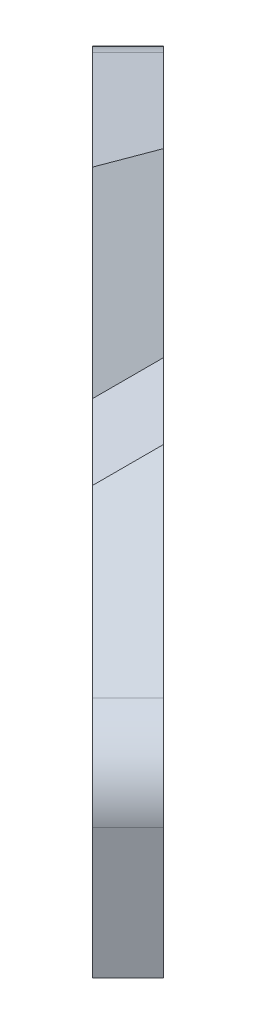
ISO-10303-21;
HEADER;
FILE_DESCRIPTION(('STEP AP214'),'2;1');
FILE_NAME('part.step','',(''),(''),'','','');
FILE_SCHEMA(('AUTOMOTIVE_DESIGN { 1 0 10303 214 1 1 1 1 }'));
ENDSEC;
DATA;
#1=APPLICATION_CONTEXT('core data for automotive mechanical design processes');
#2=APPLICATION_PROTOCOL_DEFINITION('international standard','automotive_design',2000,#1);
#3=PRODUCT_CONTEXT('',#1,'mechanical');
#4=PRODUCT('Part','Part','',(#3));
#5=PRODUCT_RELATED_PRODUCT_CATEGORY('part','',(#4));
#6=PRODUCT_DEFINITION_FORMATION('','',#4);
#7=PRODUCT_DEFINITION_CONTEXT('part definition',#1,'design');
#8=PRODUCT_DEFINITION('design','',#6,#7);
#9=PRODUCT_DEFINITION_SHAPE('','',#8);
#10=(LENGTH_UNIT() NAMED_UNIT(*) SI_UNIT(.MILLI.,.METRE.));
#11=(NAMED_UNIT(*) PLANE_ANGLE_UNIT() SI_UNIT($,.RADIAN.));
#12=(NAMED_UNIT(*) SI_UNIT($,.STERADIAN.) SOLID_ANGLE_UNIT());
#13=UNCERTAINTY_MEASURE_WITH_UNIT(LENGTH_MEASURE(1.E-05),#10,'distance_accuracy_value','');
#14=(GEOMETRIC_REPRESENTATION_CONTEXT(3) GLOBAL_UNCERTAINTY_ASSIGNED_CONTEXT((#13)) GLOBAL_UNIT_ASSIGNED_CONTEXT((#10,
#11,#12)) REPRESENTATION_CONTEXT('',''));
#15=CARTESIAN_POINT('',(0.,0.,0.));
#16=DIRECTION('',(0.,0.,1.));
#17=DIRECTION('',(1.,0.,0.));
#18=AXIS2_PLACEMENT_3D('',#15,#16,#17);
#19=CARTESIAN_POINT('',(134.35,30.0000000000001,127.278932188135));
#20=DIRECTION('',(0.707106781186548,0.,0.707106781186548));
#21=DIRECTION('',(0.707106781186548,0.,-0.707106781186548));
#22=AXIS2_PLACEMENT_3D('',#19,#20,#21);
#23=PLANE('',#22);
#24=DIRECTION('',(0.,-1.,0.));
#25=VECTOR('',#24,1.);
#26=CARTESIAN_POINT('',(134.35,30.0000000000001,127.278932188135));
#27=LINE('',#26,#25);
#28=CARTESIAN_POINT('',(134.35,3.46974780714426,127.278932188135));
#29=VERTEX_POINT('',#28);
#30=CARTESIAN_POINT('',(134.35,-22.5,127.278932188135));
#31=VERTEX_POINT('',#30);
#32=EDGE_CURVE('E114',#29,#31,#27,.T.);
#33=ORIENTED_EDGE('',*,*,#32,.F.);
#34=DIRECTION('',(0.707106781186548,0.,-0.707106781186547));
#35=VECTOR('',#34,1.);
#36=CARTESIAN_POINT('',(-51.577927815935,3.46974780714425,313.206860004069));
#37=LINE('',#36,#35);
#38=CARTESIAN_POINT('',(127.278932188135,3.46974780714434,134.35));
#39=VERTEX_POINT('',#38);
#40=EDGE_CURVE('E147',#39,#29,#37,.T.);
#41=ORIENTED_EDGE('',*,*,#40,.F.);
#42=DIRECTION('',(0.,-1.,0.));
#43=VECTOR('',#42,1.);
#44=CARTESIAN_POINT('',(127.278932188135,30.0000000000001,134.35));
#45=LINE('',#44,#43);
#46=CARTESIAN_POINT('',(127.278932188135,-22.5,134.35));
#47=VERTEX_POINT('',#46);
#48=EDGE_CURVE('E130',#39,#47,#45,.T.);
#49=ORIENTED_EDGE('',*,*,#48,.T.);
#50=DIRECTION('',(-0.707106781186547,0.,0.707106781186547));
#51=VECTOR('',#50,1.);
#52=CARTESIAN_POINT('',(134.35,-22.5,127.278932188135));
#53=LINE('',#52,#51);
#54=EDGE_CURVE('E128',#31,#47,#53,.T.);
#55=ORIENTED_EDGE('',*,*,#54,.F.);
#56=EDGE_LOOP('',(#33,#41,#49,#55));
#57=FACE_BOUND('',#56,.T.);
#58=ADVANCED_FACE('F35',(#57),#23,.T.);
#59=CARTESIAN_POINT('',(0.,30.0000000000001,7.07106781186548));
#60=DIRECTION('',(-0.707106781186548,0.,-0.707106781186547));
#61=DIRECTION('',(-0.707106781186547,0.,0.707106781186548));
#62=AXIS2_PLACEMENT_3D('',#59,#60,#61);
#63=PLANE('',#62);
#64=DIRECTION('',(0.,-1.,0.));
#65=VECTOR('',#64,1.);
#66=CARTESIAN_POINT('',(0.,30.0000000000001,7.07106781186548));
#67=LINE('',#66,#65);
#68=CARTESIAN_POINT('',(0.,3.48328821683044,7.07106781186551));
#69=VERTEX_POINT('',#68);
#70=CARTESIAN_POINT('',(0.,-22.5,7.07106781186548));
#71=VERTEX_POINT('',#70);
#72=EDGE_CURVE('E169',#69,#71,#67,.T.);
#73=ORIENTED_EDGE('',*,*,#72,.F.);
#74=DIRECTION('',(0.707106781186548,0.,-0.707106781186547));
#75=VECTOR('',#74,1.);
#76=CARTESIAN_POINT('',(-178.856860004069,3.48328821683043,185.927927815935));
#77=LINE('',#76,#75);
#78=CARTESIAN_POINT('',(7.07106781186547,3.48328821683044,0.));
#79=VERTEX_POINT('',#78);
#80=EDGE_CURVE('E149',#69,#79,#77,.T.);
#81=ORIENTED_EDGE('',*,*,#80,.T.);
#82=DIRECTION('',(0.,-1.,0.));
#83=VECTOR('',#82,1.);
#84=CARTESIAN_POINT('',(7.07106781186547,30.0000000000001,0.));
#85=LINE('',#84,#83);
#86=CARTESIAN_POINT('',(7.07106781186548,-22.5,0.));
#87=VERTEX_POINT('',#86);
#88=EDGE_CURVE('E125',#79,#87,#85,.T.);
#89=ORIENTED_EDGE('',*,*,#88,.T.);
#90=DIRECTION('',(0.707106781186547,0.,-0.707106781186548));
#91=VECTOR('',#90,1.);
#92=CARTESIAN_POINT('',(0.,-22.5,7.07106781186548));
#93=LINE('',#92,#91);
#94=EDGE_CURVE('E139',#71,#87,#93,.T.);
#95=ORIENTED_EDGE('',*,*,#94,.F.);
#96=EDGE_LOOP('',(#73,#81,#89,#95));
#97=FACE_BOUND('',#96,.T.);
#98=ADVANCED_FACE('F213',(#97),#63,.T.);
#99=CARTESIAN_POINT('',(39.675,30.,134.35));
#100=DIRECTION('',(-0.707106781186547,-0.707106781186548,0.));
#101=DIRECTION('',(0.707106781186548,-0.707106781186547,0.));
#102=AXIS2_PLACEMENT_3D('',#99,#100,#101);
#103=PLANE('',#102);
#104=DIRECTION('',(0.577350269189626,-0.577350269189626,0.577350269189626));
#105=VECTOR('',#104,1.);
#106=CARTESIAN_POINT('',(73.5903559372885,-3.91535593728848,66.519288125423));
#107=LINE('',#106,#105);
#108=CARTESIAN_POINT('',(41.6149362995516,28.0600637004484,34.5438684876861));
#109=VERTEX_POINT('',#108);
#110=CARTESIAN_POINT('',(59.675,10.,52.6039321881345));
#111=VERTEX_POINT('',#110);
#112=EDGE_CURVE('E124',#109,#111,#107,.T.);
#113=ORIENTED_EDGE('',*,*,#112,.F.);
#114=DIRECTION('',(-0.155110361311735,0.155110361311735,0.975644172650811));
#115=VECTOR('',#114,1.);
#116=CARTESIAN_POINT('',(26.4176761685357,43.2573238314643,130.134634711776));
#117=LINE('',#116,#115);
#118=CARTESIAN_POINT('',(39.675,30.,46.7460678118655));
#119=VERTEX_POINT('',#118);
#120=EDGE_CURVE('E163',#109,#119,#117,.T.);
#121=ORIENTED_EDGE('',*,*,#120,.T.);
#122=DIRECTION('',(-0.577350269189626,0.577350269189626,-0.577350269189626));
#123=VECTOR('',#122,1.);
#124=CARTESIAN_POINT('',(68.8763107293782,0.798689270621839,75.9473785412437));
#125=LINE('',#124,#123);
#126=CARTESIAN_POINT('',(59.675,10.,66.7460678118655));
#127=VERTEX_POINT('',#126);
#128=EDGE_CURVE('E178',#127,#119,#125,.T.);
#129=ORIENTED_EDGE('',*,*,#128,.F.);
#130=DIRECTION('',(0.,0.,-1.));
#131=VECTOR('',#130,1.);
#132=CARTESIAN_POINT('',(59.675,10.,134.35));
#133=LINE('',#132,#131);
#134=EDGE_CURVE('E185',#127,#111,#133,.T.);
#135=ORIENTED_EDGE('',*,*,#134,.T.);
#136=EDGE_LOOP('',(#113,#121,#129,#135));
#137=FACE_BOUND('',#136,.T.);
#138=ADVANCED_FACE('F205',(#137),#103,.F.);
#139=CARTESIAN_POINT('',(59.675,10.,134.35));
#140=DIRECTION('',(0.,-1.,0.));
#141=DIRECTION('',(1.,0.,0.));
#142=AXIS2_PLACEMENT_3D('',#139,#140,#141);
#143=PLANE('',#142);
#144=DIRECTION('',(0.707106781186548,0.,0.707106781186548));
#145=VECTOR('',#144,1.);
#146=CARTESIAN_POINT('',(100.548033905933,10.,93.4769660940673));
#147=LINE('',#146,#145);
#148=CARTESIAN_POINT('',(74.675,10.,67.6039321881345));
#149=VERTEX_POINT('',#148);
#150=EDGE_CURVE('E173',#111,#149,#147,.T.);
#151=ORIENTED_EDGE('',*,*,#150,.F.);
#152=ORIENTED_EDGE('',*,*,#134,.F.);
#153=DIRECTION('',(-0.707106781186548,0.,-0.707106781186548));
#154=VECTOR('',#153,1.);
#155=CARTESIAN_POINT('',(93.4769660940673,10.,100.548033905933));
#156=LINE('',#155,#154);
#157=CARTESIAN_POINT('',(74.675,10.,81.7460678118655));
#158=VERTEX_POINT('',#157);
#159=EDGE_CURVE('E181',#158,#127,#156,.T.);
#160=ORIENTED_EDGE('',*,*,#159,.F.);
#161=DIRECTION('',(0.,0.,-1.));
#162=VECTOR('',#161,1.);
#163=CARTESIAN_POINT('',(74.675,10.,134.35));
#164=LINE('',#163,#162);
#165=EDGE_CURVE('E188',#158,#149,#164,.T.);
#166=ORIENTED_EDGE('',*,*,#165,.T.);
#167=EDGE_LOOP('',(#151,#152,#160,#166));
#168=FACE_BOUND('',#167,.T.);
#169=ADVANCED_FACE('F201',(#168),#143,.F.);
#170=CARTESIAN_POINT('',(74.675,10.,134.35));
#171=DIRECTION('',(0.707106781186548,-0.707106781186547,0.));
#172=DIRECTION('',(0.707106781186547,0.707106781186548,0.));
#173=AXIS2_PLACEMENT_3D('',#170,#171,#172);
#174=PLANE('',#173);
#175=DIRECTION('',(-0.577350269189626,-0.577350269189626,-0.577350269189626));
#176=VECTOR('',#175,1.);
#177=CARTESIAN_POINT('',(92.2096440627115,27.5346440627115,99.280711874577));
#178=LINE('',#177,#176);
#179=CARTESIAN_POINT('',(92.6918990117397,28.0168990117397,99.7629668236051));
#180=VERTEX_POINT('',#179);
#181=EDGE_CURVE('E183',#180,#158,#178,.T.);
#182=ORIENTED_EDGE('',*,*,#181,.F.);
#183=DIRECTION('',(0.154544935465042,0.154544935465043,-0.975823614104625));
#184=VECTOR('',#183,1.);
#185=CARTESIAN_POINT('',(86.6152408764308,21.9402408764309,138.132043658327));
#186=LINE('',#185,#184);
#187=CARTESIAN_POINT('',(94.6254236468151,29.9504236468151,87.5543558349496));
#188=VERTEX_POINT('',#187);
#189=EDGE_CURVE('E158',#180,#188,#186,.T.);
#190=ORIENTED_EDGE('',*,*,#189,.T.);
#191=DIRECTION('',(0.577350269189626,0.577350269189626,0.577350269189626));
#192=VECTOR('',#191,1.);
#193=CARTESIAN_POINT('',(96.9236892706218,32.2486892706219,89.8526214587563));
#194=LINE('',#193,#192);
#195=EDGE_CURVE('E175',#149,#188,#194,.T.);
#196=ORIENTED_EDGE('',*,*,#195,.F.);
#197=ORIENTED_EDGE('',*,*,#165,.F.);
#198=EDGE_LOOP('',(#182,#190,#196,#197));
#199=FACE_BOUND('',#198,.T.);
#200=ADVANCED_FACE('F37',(#199),#174,.F.);
#201=CARTESIAN_POINT('',(127.278932188135,30.0000000000001,134.35));
#202=DIRECTION('',(-0.707106781186548,0.,0.707106781186548));
#203=DIRECTION('',(0.707106781186548,0.,0.707106781186548));
#204=AXIS2_PLACEMENT_3D('',#201,#202,#203);
#205=PLANE('',#204);
#206=DIRECTION('',(0.683117113408603,0.258267339662987,0.683117113408603));
#207=VECTOR('',#206,1.);
#208=CARTESIAN_POINT('',(121.435573061922,60.9113697776642,128.506640873787));
#209=LINE('',#208,#207);
#210=CARTESIAN_POINT('',(7.86726290927764,17.9743905139046,14.9383307211431));
#211=VERTEX_POINT('',#210);
#212=EDGE_CURVE('E166',#211,#119,#209,.T.);
#213=ORIENTED_EDGE('',*,*,#212,.F.);
#214=CARTESIAN_POINT('',(10.6066017177982,3.48328821683052,17.6776695296637));
#215=DIRECTION('',(-0.707106781186548,0.,0.707106781186548));
#216=DIRECTION('',(0.707106781186548,0.,0.707106781186548));
#217=AXIS2_PLACEMENT_3D('',#214,#215,#216);
#218=CIRCLE('',#217,15.);
#219=EDGE_CURVE('E154',#69,#211,#218,.F.);
#220=ORIENTED_EDGE('',*,*,#219,.F.);
#221=ORIENTED_EDGE('',*,*,#72,.T.);
#222=DIRECTION('',(-0.707106781186548,0.,-0.707106781186548));
#223=VECTOR('',#222,1.);
#224=CARTESIAN_POINT('',(127.278932188135,-22.5,134.35));
#225=LINE('',#224,#223);
#226=EDGE_CURVE('E134',#47,#71,#225,.T.);
#227=ORIENTED_EDGE('',*,*,#226,.F.);
#228=ORIENTED_EDGE('',*,*,#48,.F.);
#229=CARTESIAN_POINT('',(116.672330470336,3.46974780714434,123.743398282202));
#230=DIRECTION('',(-0.707106781186548,0.,0.707106781186548));
#231=DIRECTION('',(0.707106781186548,0.,0.707106781186548));
#232=AXIS2_PLACEMENT_3D('',#229,#230,#231);
#233=CIRCLE('',#232,15.);
#234=CARTESIAN_POINT('',(119.400034012463,17.9652390638263,126.471101824328));
#235=VERTEX_POINT('',#234);
#236=EDGE_CURVE('E50',#235,#39,#233,.F.);
#237=ORIENTED_EDGE('',*,*,#236,.F.);
#238=DIRECTION('',(0.683324010948675,-0.25717035622721,0.683324010948675));
#239=VECTOR('',#238,1.);
#240=CARTESIAN_POINT('',(124.64297199842,15.9920488818305,131.714039810286));
#241=LINE('',#240,#239);
#242=EDGE_CURVE('E161',#180,#235,#241,.T.);
#243=ORIENTED_EDGE('',*,*,#242,.F.);
#244=ORIENTED_EDGE('',*,*,#181,.T.);
#245=ORIENTED_EDGE('',*,*,#159,.T.);
#246=ORIENTED_EDGE('',*,*,#128,.T.);
#247=EDGE_LOOP('',(#213,#220,#221,#227,#228,#237,#243,#244,#245,#246));
#248=FACE_BOUND('',#247,.T.);
#249=ADVANCED_FACE('F208',(#248),#205,.T.);
#250=CARTESIAN_POINT('',(7.07106781186547,30.0000000000001,0.));
#251=DIRECTION('',(0.707106781186548,0.,-0.707106781186548));
#252=DIRECTION('',(-0.707106781186548,0.,-0.707106781186548));
#253=AXIS2_PLACEMENT_3D('',#250,#251,#252);
#254=PLANE('',#253);
#255=DIRECTION('',(-0.683117113408603,-0.258267339662987,-0.683117113408603));
#256=VECTOR('',#255,1.);
#257=CARTESIAN_POINT('',(9.71747040523996,16.000530281049,2.64640259337449));
#258=LINE('',#257,#256);
#259=CARTESIAN_POINT('',(14.9383307211431,17.9743905139046,7.8672629092777));
#260=VERTEX_POINT('',#259);
#261=EDGE_CURVE('E12',#109,#260,#258,.T.);
#262=ORIENTED_EDGE('',*,*,#261,.F.);
#263=ORIENTED_EDGE('',*,*,#112,.T.);
#264=ORIENTED_EDGE('',*,*,#150,.T.);
#265=ORIENTED_EDGE('',*,*,#195,.T.);
#266=DIRECTION('',(-0.683324010948675,0.25717035622721,-0.683324010948675));
#267=VECTOR('',#266,1.);
#268=CARTESIAN_POINT('',(12.8529024460055,60.7256753134638,5.78183463414004));
#269=LINE('',#268,#267);
#270=CARTESIAN_POINT('',(126.471101824328,17.9652390638263,119.400034012463));
#271=VERTEX_POINT('',#270);
#272=EDGE_CURVE('E43',#271,#188,#269,.T.);
#273=ORIENTED_EDGE('',*,*,#272,.F.);
#274=CARTESIAN_POINT('',(123.743398282202,3.46974780714434,116.672330470336));
#275=DIRECTION('',(0.707106781186548,0.,-0.707106781186548));
#276=DIRECTION('',(-0.707106781186548,0.,-0.707106781186548));
#277=AXIS2_PLACEMENT_3D('',#274,#275,#276);
#278=CIRCLE('',#277,15.);
#279=EDGE_CURVE('E122',#29,#271,#278,.F.);
#280=ORIENTED_EDGE('',*,*,#279,.F.);
#281=ORIENTED_EDGE('',*,*,#32,.T.);
#282=DIRECTION('',(0.707106781186548,0.,0.707106781186548));
#283=VECTOR('',#282,1.);
#284=CARTESIAN_POINT('',(7.07106781186548,-22.5,0.));
#285=LINE('',#284,#283);
#286=EDGE_CURVE('E120',#87,#31,#285,.T.);
#287=ORIENTED_EDGE('',*,*,#286,.F.);
#288=ORIENTED_EDGE('',*,*,#88,.F.);
#289=CARTESIAN_POINT('',(17.6776695296637,3.48328821683052,10.6066017177982));
#290=DIRECTION('',(0.707106781186548,0.,-0.707106781186548));
#291=DIRECTION('',(-0.707106781186548,0.,-0.707106781186548));
#292=AXIS2_PLACEMENT_3D('',#289,#290,#291);
#293=CIRCLE('',#292,15.);
#294=EDGE_CURVE('E58',#260,#79,#293,.F.);
#295=ORIENTED_EDGE('',*,*,#294,.F.);
#296=EDGE_LOOP('',(#262,#263,#264,#265,#273,#280,#281,#287,#288,#295));
#297=FACE_BOUND('',#296,.T.);
#298=ADVANCED_FACE('F117',(#297),#254,.T.);
#299=CARTESIAN_POINT('',(-168.250258286271,3.48328821683051,196.534529533733));
#300=DIRECTION('',(0.707106781186548,0.,-0.707106781186547));
#301=DIRECTION('',(-0.707106781186547,0.,-0.707106781186548));
#302=AXIS2_PLACEMENT_3D('',#299,#300,#301);
#303=CYLINDRICAL_SURFACE('',#302,15.);
#304=ORIENTED_EDGE('',*,*,#80,.F.);
#305=ORIENTED_EDGE('',*,*,#219,.T.);
#306=DIRECTION('',(0.707106781186548,0.,-0.707106781186547));
#307=VECTOR('',#306,1.);
#308=CARTESIAN_POINT('',(-170.989597094792,17.9743905139046,193.795190725213));
#309=LINE('',#308,#307);
#310=EDGE_CURVE('E151',#211,#260,#309,.T.);
#311=ORIENTED_EDGE('',*,*,#310,.T.);
#312=ORIENTED_EDGE('',*,*,#294,.T.);
#313=EDGE_LOOP('',(#304,#305,#311,#312));
#314=FACE_BOUND('',#313,.T.);
#315=ADVANCED_FACE('F217',(#314),#303,.T.);
#316=CARTESIAN_POINT('',(-139.181860004069,30.,225.602927815935));
#317=DIRECTION('',(0.182622587234708,-0.966073486471606,0.182622587234708));
#318=DIRECTION('',(0.,-0.185746265255385,-0.982597743200989));
#319=AXIS2_PLACEMENT_3D('',#316,#317,#318);
#320=PLANE('',#319);
#321=ORIENTED_EDGE('',*,*,#310,.F.);
#322=ORIENTED_EDGE('',*,*,#212,.T.);
#323=ORIENTED_EDGE('',*,*,#120,.F.);
#324=ORIENTED_EDGE('',*,*,#261,.T.);
#325=EDGE_LOOP('',(#321,#322,#323,#324));
#326=FACE_BOUND('',#325,.T.);
#327=ADVANCED_FACE('F216',(#326),#320,.F.);
#328=CARTESIAN_POINT('',(-62.1845295337332,3.46974780714433,302.600258286271));
#329=DIRECTION('',(0.707106781186548,0.,-0.707106781186547));
#330=DIRECTION('',(-0.707106781186547,0.,-0.707106781186548));
#331=AXIS2_PLACEMENT_3D('',#328,#329,#330);
#332=CYLINDRICAL_SURFACE('',#331,15.);
#333=DIRECTION('',(0.707106781186548,0.,-0.707106781186547));
#334=VECTOR('',#333,1.);
#335=CARTESIAN_POINT('',(-59.4568259916069,17.9652390638263,305.327961828397));
#336=LINE('',#335,#334);
#337=EDGE_CURVE('E144',#235,#271,#336,.T.);
#338=ORIENTED_EDGE('',*,*,#337,.F.);
#339=ORIENTED_EDGE('',*,*,#236,.T.);
#340=ORIENTED_EDGE('',*,*,#40,.T.);
#341=ORIENTED_EDGE('',*,*,#279,.T.);
#342=EDGE_LOOP('',(#338,#339,#340,#341));
#343=FACE_BOUND('',#342,.T.);
#344=ADVANCED_FACE('F210',(#343),#332,.T.);
#345=CARTESIAN_POINT('',(-59.4568259916069,17.9652390638263,305.327961828397));
#346=DIRECTION('',(-0.18184690280842,-0.966366083778798,-0.181846902808421));
#347=DIRECTION('',(0.,0.184930272032471,-0.982751644356801));
#348=AXIS2_PLACEMENT_3D('',#345,#346,#347);
#349=PLANE('',#348);
#350=ORIENTED_EDGE('',*,*,#189,.F.);
#351=ORIENTED_EDGE('',*,*,#242,.T.);
#352=ORIENTED_EDGE('',*,*,#337,.T.);
#353=ORIENTED_EDGE('',*,*,#272,.T.);
#354=EDGE_LOOP('',(#350,#351,#352,#353));
#355=FACE_BOUND('',#354,.T.);
#356=ADVANCED_FACE('F191',(#355),#349,.F.);
#357=CARTESIAN_POINT('',(0.,-22.5,0.));
#358=DIRECTION('',(0.,-1.,0.));
#359=DIRECTION('',(1.,0.,0.));
#360=AXIS2_PLACEMENT_3D('',#357,#358,#359);
#361=PLANE('',#360);
#362=ORIENTED_EDGE('',*,*,#286,.T.);
#363=ORIENTED_EDGE('',*,*,#54,.T.);
#364=ORIENTED_EDGE('',*,*,#226,.T.);
#365=ORIENTED_EDGE('',*,*,#94,.T.);
#366=EDGE_LOOP('',(#362,#363,#364,#365));
#367=FACE_BOUND('',#366,.T.);
#368=ADVANCED_FACE('F137',(#367),#361,.T.);
#369=CLOSED_SHELL('',(#58,#98,#138,#169,#200,#249,#298,#315,#327,#344,#356,#368));
#370=MANIFOLD_SOLID_BREP('B2',#369);
#371=ADVANCED_BREP_SHAPE_REPRESENTATION('',(#18,#370),#14);
#372=SHAPE_DEFINITION_REPRESENTATION(#9,#371);
ENDSEC;
END-ISO-10303-21;
